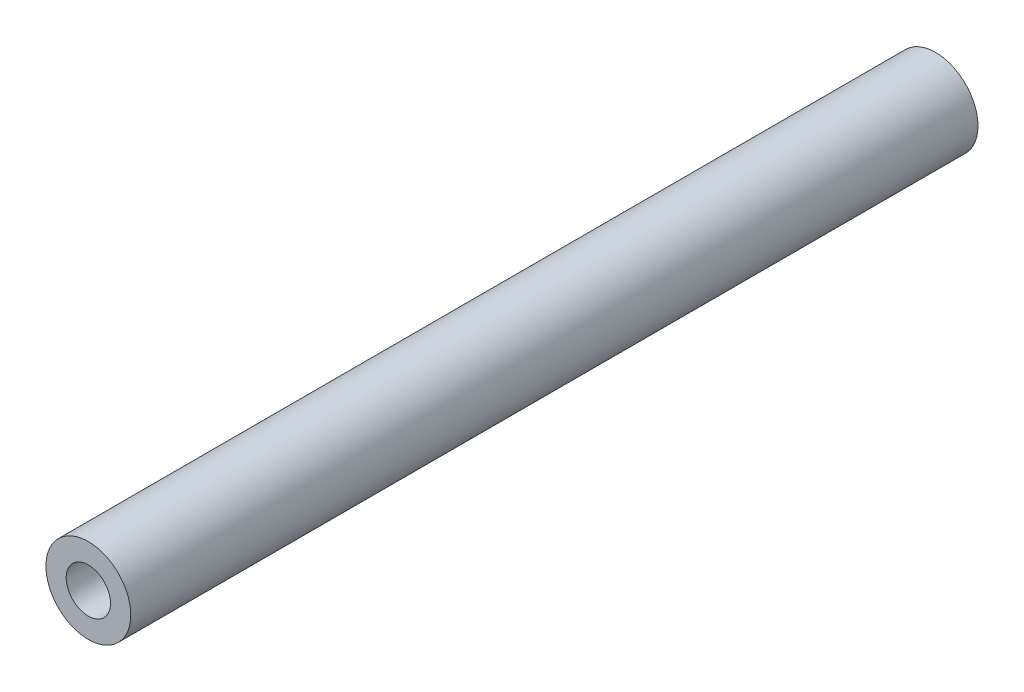
ISO-10303-21;
HEADER;
FILE_DESCRIPTION(('STEP AP214'),'2;1');
FILE_NAME('part.step','',(''),(''),'','','');
FILE_SCHEMA(('AUTOMOTIVE_DESIGN { 1 0 10303 214 1 1 1 1 }'));
ENDSEC;
DATA;
#1=APPLICATION_CONTEXT('core data for automotive mechanical design processes');
#2=APPLICATION_PROTOCOL_DEFINITION('international standard','automotive_design',2000,#1);
#3=PRODUCT_CONTEXT('',#1,'mechanical');
#4=PRODUCT('Part','Part','',(#3));
#5=PRODUCT_RELATED_PRODUCT_CATEGORY('part','',(#4));
#6=PRODUCT_DEFINITION_FORMATION('','',#4);
#7=PRODUCT_DEFINITION_CONTEXT('part definition',#1,'design');
#8=PRODUCT_DEFINITION('design','',#6,#7);
#9=PRODUCT_DEFINITION_SHAPE('','',#8);
#10=(LENGTH_UNIT() NAMED_UNIT(*) SI_UNIT(.MILLI.,.METRE.));
#11=(NAMED_UNIT(*) PLANE_ANGLE_UNIT() SI_UNIT($,.RADIAN.));
#12=(NAMED_UNIT(*) SI_UNIT($,.STERADIAN.) SOLID_ANGLE_UNIT());
#13=UNCERTAINTY_MEASURE_WITH_UNIT(LENGTH_MEASURE(1.E-05),#10,'distance_accuracy_value','');
#14=(GEOMETRIC_REPRESENTATION_CONTEXT(3) GLOBAL_UNCERTAINTY_ASSIGNED_CONTEXT((#13)) GLOBAL_UNIT_ASSIGNED_CONTEXT((#10,
#11,#12)) REPRESENTATION_CONTEXT('',''));
#15=CARTESIAN_POINT('',(0.,0.,0.));
#16=DIRECTION('',(0.,0.,1.));
#17=DIRECTION('',(1.,0.,0.));
#18=AXIS2_PLACEMENT_3D('',#15,#16,#17);
#19=CARTESIAN_POINT('',(0.,0.,-95.123));
#20=DIRECTION('',(0.,0.,1.));
#21=DIRECTION('',(1.,0.,0.));
#22=AXIS2_PLACEMENT_3D('',#19,#20,#21);
#23=CYLINDRICAL_SURFACE('',#22,4.7625);
#24=CARTESIAN_POINT('',(0.,0.,-95.123));
#25=DIRECTION('',(0.,0.,1.));
#26=DIRECTION('',(1.,0.,0.));
#27=AXIS2_PLACEMENT_3D('',#24,#25,#26);
#28=CIRCLE('',#27,4.7625);
#29=CARTESIAN_POINT('',(4.7625,0.,-95.123));
#30=VERTEX_POINT('',#29);
#31=EDGE_CURVE('E10',#30,#30,#28,.T.);
#32=CARTESIAN_POINT('',(0.,0.,0.));
#33=DIRECTION('',(0.,0.,1.));
#34=DIRECTION('',(1.,0.,0.));
#35=AXIS2_PLACEMENT_3D('',#32,#33,#34);
#36=CIRCLE('',#35,4.7625);
#37=CARTESIAN_POINT('',(4.7625,0.,0.));
#38=VERTEX_POINT('',#37);
#39=EDGE_CURVE('E40',#38,#38,#36,.T.);
#40=CARTESIAN_POINT('',(4.7625,0.,-95.123));
#41=CARTESIAN_POINT('',(4.7625,0.,-94.1321354166667));
#42=CARTESIAN_POINT('',(4.7625,0.,-93.1412708333334));
#43=CARTESIAN_POINT('',(4.7625,0.,-91.1595416666667));
#44=CARTESIAN_POINT('',(4.7625,0.,-90.1686770833333));
#45=CARTESIAN_POINT('',(4.7625,0.,-88.1869479166667));
#46=CARTESIAN_POINT('',(4.7625,0.,-87.1960833333333));
#47=CARTESIAN_POINT('',(4.7625,0.,-85.2143541666667));
#48=CARTESIAN_POINT('',(4.7625,0.,-84.2234895833333));
#49=CARTESIAN_POINT('',(4.7625,0.,-82.2417604166667));
#50=CARTESIAN_POINT('',(4.7625,0.,-81.2508958333333));
#51=CARTESIAN_POINT('',(4.7625,0.,-79.2691666666667));
#52=CARTESIAN_POINT('',(4.7625,0.,-78.2783020833333));
#53=CARTESIAN_POINT('',(4.7625,0.,-76.2965729166667));
#54=CARTESIAN_POINT('',(4.7625,0.,-75.3057083333333));
#55=CARTESIAN_POINT('',(4.7625,0.,-73.3239791666667));
#56=CARTESIAN_POINT('',(4.7625,0.,-72.3331145833333));
#57=CARTESIAN_POINT('',(4.7625,0.,-70.3513854166667));
#58=CARTESIAN_POINT('',(4.7625,0.,-69.3605208333333));
#59=CARTESIAN_POINT('',(4.7625,0.,-67.3787916666667));
#60=CARTESIAN_POINT('',(4.7625,0.,-66.3879270833333));
#61=CARTESIAN_POINT('',(4.7625,0.,-64.4061979166667));
#62=CARTESIAN_POINT('',(4.7625,0.,-63.4153333333333));
#63=CARTESIAN_POINT('',(4.7625,0.,-61.4336041666667));
#64=CARTESIAN_POINT('',(4.7625,0.,-60.4427395833333));
#65=CARTESIAN_POINT('',(4.7625,0.,-58.4610104166667));
#66=CARTESIAN_POINT('',(4.7625,0.,-57.4701458333333));
#67=CARTESIAN_POINT('',(4.7625,0.,-55.4884166666667));
#68=CARTESIAN_POINT('',(4.7625,0.,-54.4975520833333));
#69=CARTESIAN_POINT('',(4.7625,0.,-52.5158229166667));
#70=CARTESIAN_POINT('',(4.7625,0.,-51.5249583333333));
#71=CARTESIAN_POINT('',(4.7625,0.,-49.5432291666667));
#72=CARTESIAN_POINT('',(4.7625,0.,-48.5523645833333));
#73=CARTESIAN_POINT('',(4.7625,0.,-46.5706354166667));
#74=CARTESIAN_POINT('',(4.7625,0.,-45.5797708333333));
#75=CARTESIAN_POINT('',(4.7625,0.,-43.5980416666667));
#76=CARTESIAN_POINT('',(4.7625,0.,-42.6071770833333));
#77=CARTESIAN_POINT('',(4.7625,0.,-40.6254479166667));
#78=CARTESIAN_POINT('',(4.7625,0.,-39.6345833333333));
#79=CARTESIAN_POINT('',(4.7625,0.,-37.6528541666667));
#80=CARTESIAN_POINT('',(4.7625,0.,-36.6619895833333));
#81=CARTESIAN_POINT('',(4.7625,0.,-34.6802604166667));
#82=CARTESIAN_POINT('',(4.7625,0.,-33.6893958333333));
#83=CARTESIAN_POINT('',(4.7625,0.,-31.7076666666667));
#84=CARTESIAN_POINT('',(4.7625,0.,-30.7168020833333));
#85=CARTESIAN_POINT('',(4.7625,0.,-28.7350729166667));
#86=CARTESIAN_POINT('',(4.7625,0.,-27.7442083333333));
#87=CARTESIAN_POINT('',(4.7625,0.,-25.7624791666667));
#88=CARTESIAN_POINT('',(4.7625,0.,-24.7716145833333));
#89=CARTESIAN_POINT('',(4.7625,0.,-22.7898854166667));
#90=CARTESIAN_POINT('',(4.7625,0.,-21.7990208333333));
#91=CARTESIAN_POINT('',(4.7625,0.,-19.8172916666667));
#92=CARTESIAN_POINT('',(4.7625,0.,-18.8264270833333));
#93=CARTESIAN_POINT('',(4.7625,0.,-16.8446979166667));
#94=CARTESIAN_POINT('',(4.7625,0.,-15.8538333333333));
#95=CARTESIAN_POINT('',(4.7625,0.,-13.8721041666667));
#96=CARTESIAN_POINT('',(4.7625,0.,-12.8812395833333));
#97=CARTESIAN_POINT('',(4.7625,0.,-10.8995104166667));
#98=CARTESIAN_POINT('',(4.7625,0.,-9.90864583333334));
#99=CARTESIAN_POINT('',(4.7625,0.,-7.92691666666667));
#100=CARTESIAN_POINT('',(4.7625,0.,-6.93605208333334));
#101=CARTESIAN_POINT('',(4.7625,0.,-4.95432291666667));
#102=CARTESIAN_POINT('',(4.7625,0.,-3.96345833333334));
#103=CARTESIAN_POINT('',(4.7625,0.,-1.98172916666667));
#104=CARTESIAN_POINT('',(4.7625,0.,-0.990864583333334));
#105=CARTESIAN_POINT('',(4.7625,0.,0.));
#106=B_SPLINE_CURVE_WITH_KNOTS('',3,(#40,#41,#42,#43,#44,#45,#46,#47,#48,#49,#50,#51,#52,#53,
#54,#55,#56,#57,#58,#59,#60,#61,#62,#63,#64,#65,#66,#67,#68,#69,#70,#71,#72,#73,#74,#75,#76,#77,
#78,#79,#80,#81,#82,#83,#84,#85,#86,#87,#88,#89,#90,#91,#92,#93,#94,#95,#96,#97,#98,#99,#100,
#101,#102,#103,#104,#105),.UNSPECIFIED.,.F.,.F.,(4,2,2,2,2,2,2,2,2,2,2,2,2,2,2,2,2,2,2,2,2,2,2,
2,2,2,2,2,2,2,2,2,4),(0.,2.97259375,5.9451875,8.91778125000001,11.890375,14.86296875,17.8355625,
20.80815625,23.78075,26.75334375,29.7259375,32.69853125,35.671125,38.64371875,41.6163125,
44.58890625,47.5615,50.53409375,53.5066875,56.47928125,59.451875,62.42446875,65.3970625,
68.36965625,71.34225,74.31484375,77.2874375,80.26003125,83.232625,86.20521875,89.1778125,
92.15040625,95.123),.UNSPECIFIED.);
#107=EDGE_CURVE('BSEAM37',#30,#38,#106,.T.);
#108=ORIENTED_EDGE('',*,*,#31,.T.);
#109=ORIENTED_EDGE('',*,*,#39,.F.);
#110=ORIENTED_EDGE('',*,*,#107,.T.);
#111=ORIENTED_EDGE('',*,*,#107,.F.);
#112=EDGE_LOOP('',(#108,#110,#109,#111));
#113=FACE_BOUND('',#112,.T.);
#114=ADVANCED_FACE('F37',(#113),#23,.T.);
#115=CARTESIAN_POINT('',(0.,0.,-95.123));
#116=DIRECTION('',(0.,0.,1.));
#117=DIRECTION('',(1.,0.,0.));
#118=AXIS2_PLACEMENT_3D('',#115,#116,#117);
#119=PLANE('',#118);
#120=CARTESIAN_POINT('',(0.,0.,-95.123));
#121=DIRECTION('',(0.,0.,1.));
#122=DIRECTION('',(1.,0.,0.));
#123=AXIS2_PLACEMENT_3D('',#120,#121,#122);
#124=CIRCLE('',#123,2.4892);
#125=CARTESIAN_POINT('',(2.4892,0.,-95.123));
#126=VERTEX_POINT('',#125);
#127=EDGE_CURVE('E50',#126,#126,#124,.T.);
#128=ORIENTED_EDGE('',*,*,#127,.T.);
#129=EDGE_LOOP('',(#128));
#130=FACE_BOUND('',#129,.T.);
#131=ORIENTED_EDGE('',*,*,#31,.F.);
#132=EDGE_LOOP('',(#131));
#133=FACE_BOUND('',#132,.T.);
#134=ADVANCED_FACE('F61',(#130,#133),#119,.F.);
#135=CARTESIAN_POINT('',(0.,0.,0.));
#136=DIRECTION('',(0.,0.,1.));
#137=DIRECTION('',(1.,0.,0.));
#138=AXIS2_PLACEMENT_3D('',#135,#136,#137);
#139=PLANE('',#138);
#140=CARTESIAN_POINT('',(0.,0.,0.));
#141=DIRECTION('',(0.,0.,1.));
#142=DIRECTION('',(1.,0.,0.));
#143=AXIS2_PLACEMENT_3D('',#140,#141,#142);
#144=CIRCLE('',#143,2.4892);
#145=CARTESIAN_POINT('',(2.4892,0.,0.));
#146=VERTEX_POINT('',#145);
#147=EDGE_CURVE('E52',#146,#146,#144,.T.);
#148=ORIENTED_EDGE('',*,*,#147,.F.);
#149=EDGE_LOOP('',(#148));
#150=FACE_BOUND('',#149,.T.);
#151=ORIENTED_EDGE('',*,*,#39,.T.);
#152=EDGE_LOOP('',(#151));
#153=FACE_BOUND('',#152,.T.);
#154=ADVANCED_FACE('F67',(#150,#153),#139,.T.);
#155=CARTESIAN_POINT('',(0.,0.,-95.123));
#156=DIRECTION('',(0.,0.,1.));
#157=DIRECTION('',(1.,0.,0.));
#158=AXIS2_PLACEMENT_3D('',#155,#156,#157);
#159=CYLINDRICAL_SURFACE('',#158,2.4892);
#160=CARTESIAN_POINT('',(2.4892,0.,-95.123));
#161=CARTESIAN_POINT('',(2.4892,0.,-94.1321354166667));
#162=CARTESIAN_POINT('',(2.4892,0.,-93.1412708333334));
#163=CARTESIAN_POINT('',(2.4892,0.,-91.1595416666667));
#164=CARTESIAN_POINT('',(2.4892,0.,-90.1686770833333));
#165=CARTESIAN_POINT('',(2.4892,0.,-88.1869479166667));
#166=CARTESIAN_POINT('',(2.4892,0.,-87.1960833333333));
#167=CARTESIAN_POINT('',(2.4892,0.,-85.2143541666667));
#168=CARTESIAN_POINT('',(2.4892,0.,-84.2234895833333));
#169=CARTESIAN_POINT('',(2.4892,0.,-82.2417604166667));
#170=CARTESIAN_POINT('',(2.4892,0.,-81.2508958333333));
#171=CARTESIAN_POINT('',(2.4892,0.,-79.2691666666667));
#172=CARTESIAN_POINT('',(2.4892,0.,-78.2783020833333));
#173=CARTESIAN_POINT('',(2.4892,0.,-76.2965729166667));
#174=CARTESIAN_POINT('',(2.4892,0.,-75.3057083333333));
#175=CARTESIAN_POINT('',(2.4892,0.,-73.3239791666667));
#176=CARTESIAN_POINT('',(2.4892,0.,-72.3331145833333));
#177=CARTESIAN_POINT('',(2.4892,0.,-70.3513854166667));
#178=CARTESIAN_POINT('',(2.4892,0.,-69.3605208333333));
#179=CARTESIAN_POINT('',(2.4892,0.,-67.3787916666667));
#180=CARTESIAN_POINT('',(2.4892,0.,-66.3879270833333));
#181=CARTESIAN_POINT('',(2.4892,0.,-64.4061979166667));
#182=CARTESIAN_POINT('',(2.4892,0.,-63.4153333333333));
#183=CARTESIAN_POINT('',(2.4892,0.,-61.4336041666667));
#184=CARTESIAN_POINT('',(2.4892,0.,-60.4427395833333));
#185=CARTESIAN_POINT('',(2.4892,0.,-58.4610104166667));
#186=CARTESIAN_POINT('',(2.4892,0.,-57.4701458333333));
#187=CARTESIAN_POINT('',(2.4892,0.,-55.4884166666667));
#188=CARTESIAN_POINT('',(2.4892,0.,-54.4975520833333));
#189=CARTESIAN_POINT('',(2.4892,0.,-52.5158229166667));
#190=CARTESIAN_POINT('',(2.4892,0.,-51.5249583333333));
#191=CARTESIAN_POINT('',(2.4892,0.,-49.5432291666667));
#192=CARTESIAN_POINT('',(2.4892,0.,-48.5523645833333));
#193=CARTESIAN_POINT('',(2.4892,0.,-46.5706354166667));
#194=CARTESIAN_POINT('',(2.4892,0.,-45.5797708333333));
#195=CARTESIAN_POINT('',(2.4892,0.,-43.5980416666667));
#196=CARTESIAN_POINT('',(2.4892,0.,-42.6071770833333));
#197=CARTESIAN_POINT('',(2.4892,0.,-40.6254479166667));
#198=CARTESIAN_POINT('',(2.4892,0.,-39.6345833333333));
#199=CARTESIAN_POINT('',(2.4892,0.,-37.6528541666667));
#200=CARTESIAN_POINT('',(2.4892,0.,-36.6619895833333));
#201=CARTESIAN_POINT('',(2.4892,0.,-34.6802604166667));
#202=CARTESIAN_POINT('',(2.4892,0.,-33.6893958333333));
#203=CARTESIAN_POINT('',(2.4892,0.,-31.7076666666667));
#204=CARTESIAN_POINT('',(2.4892,0.,-30.7168020833333));
#205=CARTESIAN_POINT('',(2.4892,0.,-28.7350729166667));
#206=CARTESIAN_POINT('',(2.4892,0.,-27.7442083333333));
#207=CARTESIAN_POINT('',(2.4892,0.,-25.7624791666667));
#208=CARTESIAN_POINT('',(2.4892,0.,-24.7716145833333));
#209=CARTESIAN_POINT('',(2.4892,0.,-22.7898854166667));
#210=CARTESIAN_POINT('',(2.4892,0.,-21.7990208333333));
#211=CARTESIAN_POINT('',(2.4892,0.,-19.8172916666667));
#212=CARTESIAN_POINT('',(2.4892,0.,-18.8264270833333));
#213=CARTESIAN_POINT('',(2.4892,0.,-16.8446979166667));
#214=CARTESIAN_POINT('',(2.4892,0.,-15.8538333333333));
#215=CARTESIAN_POINT('',(2.4892,0.,-13.8721041666667));
#216=CARTESIAN_POINT('',(2.4892,0.,-12.8812395833333));
#217=CARTESIAN_POINT('',(2.4892,0.,-10.8995104166667));
#218=CARTESIAN_POINT('',(2.4892,0.,-9.90864583333334));
#219=CARTESIAN_POINT('',(2.4892,0.,-7.92691666666667));
#220=CARTESIAN_POINT('',(2.4892,0.,-6.93605208333334));
#221=CARTESIAN_POINT('',(2.4892,0.,-4.95432291666667));
#222=CARTESIAN_POINT('',(2.4892,0.,-3.96345833333334));
#223=CARTESIAN_POINT('',(2.4892,0.,-1.98172916666667));
#224=CARTESIAN_POINT('',(2.4892,0.,-0.990864583333334));
#225=CARTESIAN_POINT('',(2.4892,0.,0.));
#226=B_SPLINE_CURVE_WITH_KNOTS('',3,(#160,#161,#162,#163,#164,#165,#166,#167,#168,#169,#170,
#171,#172,#173,#174,#175,#176,#177,#178,#179,#180,#181,#182,#183,#184,#185,#186,#187,#188,#189,
#190,#191,#192,#193,#194,#195,#196,#197,#198,#199,#200,#201,#202,#203,#204,#205,#206,#207,#208,
#209,#210,#211,#212,#213,#214,#215,#216,#217,#218,#219,#220,#221,#222,#223,#224,#225),
.UNSPECIFIED.,.F.,.F.,(4,2,2,2,2,2,2,2,2,2,2,2,2,2,2,2,2,2,2,2,2,2,2,2,2,2,2,2,2,2,2,2,4),(0.,
2.97259375,5.9451875,8.91778125000001,11.890375,14.86296875,17.8355625,20.80815625,23.78075,
26.75334375,29.7259375,32.69853125,35.671125,38.64371875,41.6163125,44.58890625,47.5615,
50.53409375,53.5066875,56.47928125,59.451875,62.42446875,65.3970625,68.36965625,71.34225,
74.31484375,77.2874375,80.26003125,83.232625,86.20521875,89.1778125,92.15040625,95.123),.UNSPECIFIED.);
#227=EDGE_CURVE('BSEAM64',#126,#146,#226,.T.);
#228=ORIENTED_EDGE('',*,*,#127,.F.);
#229=ORIENTED_EDGE('',*,*,#147,.T.);
#230=ORIENTED_EDGE('',*,*,#227,.T.);
#231=ORIENTED_EDGE('',*,*,#227,.F.);
#232=EDGE_LOOP('',(#228,#230,#229,#231));
#233=FACE_BOUND('',#232,.T.);
#234=ADVANCED_FACE('F64',(#233),#159,.F.);
#235=CLOSED_SHELL('',(#114,#134,#154,#234));
#236=MANIFOLD_SOLID_BREP('B2',#235);
#237=ADVANCED_BREP_SHAPE_REPRESENTATION('',(#18,#236),#14);
#238=SHAPE_DEFINITION_REPRESENTATION(#9,#237);
ENDSEC;
END-ISO-10303-21;
